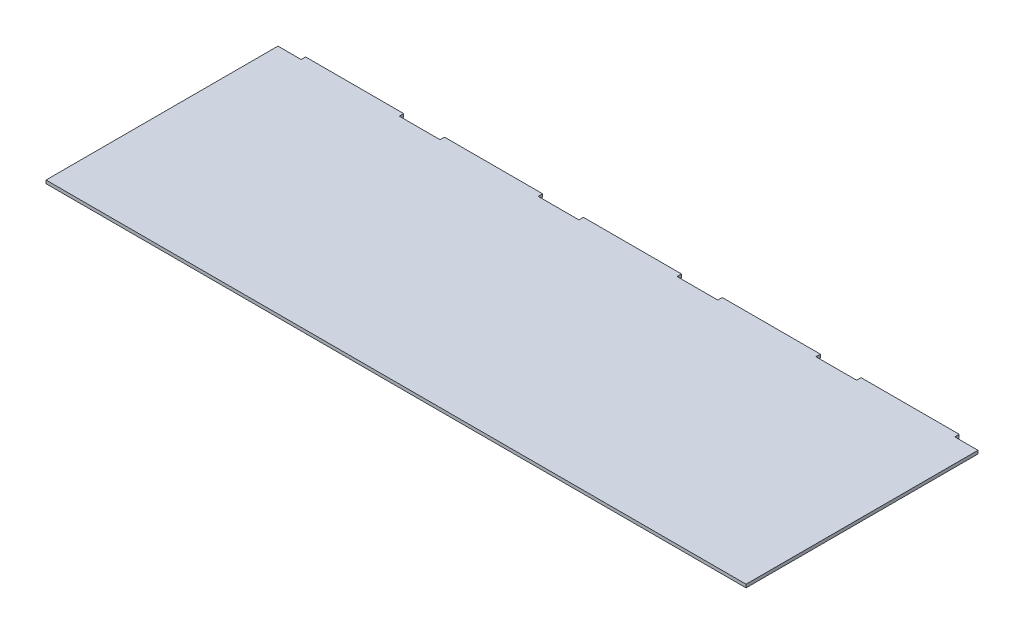
ISO-10303-21;
HEADER;
FILE_DESCRIPTION(('STEP AP214'),'2;1');
FILE_NAME('part.step','',(''),(''),'','','');
FILE_SCHEMA(('AUTOMOTIVE_DESIGN { 1 0 10303 214 1 1 1 1 }'));
ENDSEC;
DATA;
#1=APPLICATION_CONTEXT('core data for automotive mechanical design processes');
#2=APPLICATION_PROTOCOL_DEFINITION('international standard','automotive_design',2000,#1);
#3=PRODUCT_CONTEXT('',#1,'mechanical');
#4=PRODUCT('Part','Part','',(#3));
#5=PRODUCT_RELATED_PRODUCT_CATEGORY('part','',(#4));
#6=PRODUCT_DEFINITION_FORMATION('','',#4);
#7=PRODUCT_DEFINITION_CONTEXT('part definition',#1,'design');
#8=PRODUCT_DEFINITION('design','',#6,#7);
#9=PRODUCT_DEFINITION_SHAPE('','',#8);
#10=(LENGTH_UNIT() NAMED_UNIT(*) SI_UNIT(.MILLI.,.METRE.));
#11=(NAMED_UNIT(*) PLANE_ANGLE_UNIT() SI_UNIT($,.RADIAN.));
#12=(NAMED_UNIT(*) SI_UNIT($,.STERADIAN.) SOLID_ANGLE_UNIT());
#13=UNCERTAINTY_MEASURE_WITH_UNIT(LENGTH_MEASURE(1.E-05),#10,'distance_accuracy_value','');
#14=(GEOMETRIC_REPRESENTATION_CONTEXT(3) GLOBAL_UNCERTAINTY_ASSIGNED_CONTEXT((#13)) GLOBAL_UNIT_ASSIGNED_CONTEXT((#10,
#11,#12)) REPRESENTATION_CONTEXT('',''));
#15=CARTESIAN_POINT('',(0.,0.,0.));
#16=DIRECTION('',(0.,0.,1.));
#17=DIRECTION('',(1.,0.,0.));
#18=AXIS2_PLACEMENT_3D('',#15,#16,#17);
#19=CARTESIAN_POINT('',(-249.174,1.143,-82.55));
#20=DIRECTION('',(0.,0.,1.));
#21=DIRECTION('',(1.,0.,0.));
#22=AXIS2_PLACEMENT_3D('',#19,#20,#21);
#23=PLANE('',#22);
#24=DIRECTION('',(0.,1.,0.));
#25=VECTOR('',#24,1.);
#26=CARTESIAN_POINT('',(-232.6386,1.14300000000078,-82.55));
#27=LINE('',#26,#25);
#28=CARTESIAN_POINT('',(-232.6386,-1.14299999999922,-82.55));
#29=VERTEX_POINT('',#28);
#30=CARTESIAN_POINT('',(-232.6386,1.143,-82.55));
#31=VERTEX_POINT('',#30);
#32=EDGE_CURVE('E440',#29,#31,#27,.T.);
#33=ORIENTED_EDGE('',*,*,#32,.F.);
#34=DIRECTION('',(-1.,0.,0.));
#35=VECTOR('',#34,1.);
#36=CARTESIAN_POINT('',(-249.174,-1.143,-82.55));
#37=LINE('',#36,#35);
#38=CARTESIAN_POINT('',(-249.174,-1.143,-82.55));
#39=VERTEX_POINT('',#38);
#40=EDGE_CURVE('E220',#29,#39,#37,.T.);
#41=ORIENTED_EDGE('',*,*,#40,.T.);
#42=DIRECTION('',(0.,-1.,0.));
#43=VECTOR('',#42,1.);
#44=CARTESIAN_POINT('',(-249.174,1.143,-82.55));
#45=LINE('',#44,#43);
#46=CARTESIAN_POINT('',(-249.174,1.143,-82.55));
#47=VERTEX_POINT('',#46);
#48=EDGE_CURVE('E43',#47,#39,#45,.T.);
#49=ORIENTED_EDGE('',*,*,#48,.F.);
#50=DIRECTION('',(-1.,0.,0.));
#51=VECTOR('',#50,1.);
#52=CARTESIAN_POINT('',(-249.174,1.143,-82.55));
#53=LINE('',#52,#51);
#54=EDGE_CURVE('E50',#31,#47,#53,.T.);
#55=ORIENTED_EDGE('',*,*,#54,.F.);
#56=EDGE_LOOP('',(#33,#41,#49,#55));
#57=FACE_BOUND('',#56,.T.);
#58=ADVANCED_FACE('F35',(#57),#23,.F.);
#59=DIRECTION('',(0.,-1.,0.));
#60=VECTOR('',#59,1.);
#61=CARTESIAN_POINT('',(-162.7886,-1.14299999999945,-82.55));
#62=LINE('',#61,#60);
#63=CARTESIAN_POINT('',(-162.7886,1.143,-82.55));
#64=VERTEX_POINT('',#63);
#65=CARTESIAN_POINT('',(-162.7886,-1.143,-82.55));
#66=VERTEX_POINT('',#65);
#67=EDGE_CURVE('E58',#64,#66,#62,.T.);
#68=ORIENTED_EDGE('',*,*,#67,.F.);
#69=CARTESIAN_POINT('',(-133.7818,1.143,-82.55));
#70=VERTEX_POINT('',#69);
#71=EDGE_CURVE('E376',#70,#64,#53,.T.);
#72=ORIENTED_EDGE('',*,*,#71,.F.);
#73=DIRECTION('',(0.,1.,0.));
#74=VECTOR('',#73,1.);
#75=CARTESIAN_POINT('',(-133.7818,1.14300000000044,-82.55));
#76=LINE('',#75,#74);
#77=CARTESIAN_POINT('',(-133.7818,-1.14299999999956,-82.55));
#78=VERTEX_POINT('',#77);
#79=EDGE_CURVE('E221',#78,#70,#76,.T.);
#80=ORIENTED_EDGE('',*,*,#79,.F.);
#81=EDGE_CURVE('E436',#78,#66,#37,.T.);
#82=ORIENTED_EDGE('',*,*,#81,.T.);
#83=EDGE_LOOP('',(#68,#72,#80,#82));
#84=FACE_BOUND('',#83,.T.);
#85=ADVANCED_FACE('F435',(#84),#23,.F.);
#86=DIRECTION('',(0.,-1.,0.));
#87=VECTOR('',#86,1.);
#88=CARTESIAN_POINT('',(-63.9318000000001,-1.1429999999998,-82.55));
#89=LINE('',#88,#87);
#90=CARTESIAN_POINT('',(-63.9318000000001,1.143,-82.55));
#91=VERTEX_POINT('',#90);
#92=CARTESIAN_POINT('',(-63.9318000000001,-1.143,-82.55));
#93=VERTEX_POINT('',#92);
#94=EDGE_CURVE('E224',#91,#93,#89,.T.);
#95=ORIENTED_EDGE('',*,*,#94,.F.);
#96=CARTESIAN_POINT('',(-34.9250000000001,1.143,-82.55));
#97=VERTEX_POINT('',#96);
#98=EDGE_CURVE('E377',#97,#91,#53,.T.);
#99=ORIENTED_EDGE('',*,*,#98,.F.);
#100=DIRECTION('',(0.,1.,0.));
#101=VECTOR('',#100,1.);
#102=CARTESIAN_POINT('',(-34.925,1.14300000000009,-82.55));
#103=LINE('',#102,#101);
#104=CARTESIAN_POINT('',(-34.925,-1.14299999999991,-82.55));
#105=VERTEX_POINT('',#104);
#106=EDGE_CURVE('E253',#105,#97,#103,.T.);
#107=ORIENTED_EDGE('',*,*,#106,.F.);
#108=EDGE_CURVE('E421',#105,#93,#37,.T.);
#109=ORIENTED_EDGE('',*,*,#108,.T.);
#110=EDGE_LOOP('',(#95,#99,#107,#109));
#111=FACE_BOUND('',#110,.T.);
#112=ADVANCED_FACE('F420',(#111),#23,.F.);
#113=DIRECTION('',(0.,-1.,0.));
#114=VECTOR('',#113,1.);
#115=CARTESIAN_POINT('',(34.925,-1.14300000000014,-82.55));
#116=LINE('',#115,#114);
#117=CARTESIAN_POINT('',(34.9249999999998,1.143,-82.55));
#118=VERTEX_POINT('',#117);
#119=CARTESIAN_POINT('',(34.9249999999998,-1.143,-82.55));
#120=VERTEX_POINT('',#119);
#121=EDGE_CURVE('E258',#118,#120,#116,.T.);
#122=ORIENTED_EDGE('',*,*,#121,.F.);
#123=CARTESIAN_POINT('',(63.9317999999998,1.143,-82.55));
#124=VERTEX_POINT('',#123);
#125=EDGE_CURVE('E381',#124,#118,#53,.T.);
#126=ORIENTED_EDGE('',*,*,#125,.F.);
#127=DIRECTION('',(0.,1.,0.));
#128=VECTOR('',#127,1.);
#129=CARTESIAN_POINT('',(63.9318,1.14299999999975,-82.55));
#130=LINE('',#129,#128);
#131=CARTESIAN_POINT('',(63.9318,-1.14300000000025,-82.55));
#132=VERTEX_POINT('',#131);
#133=EDGE_CURVE('E280',#132,#124,#130,.T.);
#134=ORIENTED_EDGE('',*,*,#133,.F.);
#135=EDGE_CURVE('E405',#132,#120,#37,.T.);
#136=ORIENTED_EDGE('',*,*,#135,.T.);
#137=EDGE_LOOP('',(#122,#126,#134,#136));
#138=FACE_BOUND('',#137,.T.);
#139=ADVANCED_FACE('F404',(#138),#23,.F.);
#140=DIRECTION('',(0.,-1.,0.));
#141=VECTOR('',#140,1.);
#142=CARTESIAN_POINT('',(133.7818,-1.14300000000049,-82.55));
#143=LINE('',#142,#141);
#144=CARTESIAN_POINT('',(133.7818,1.143,-82.55));
#145=VERTEX_POINT('',#144);
#146=CARTESIAN_POINT('',(133.7818,-1.143,-82.55));
#147=VERTEX_POINT('',#146);
#148=EDGE_CURVE('E285',#145,#147,#143,.T.);
#149=ORIENTED_EDGE('',*,*,#148,.F.);
#150=CARTESIAN_POINT('',(162.7886,1.1429999999994,-82.55));
#151=VERTEX_POINT('',#150);
#152=EDGE_CURVE('E343',#151,#145,#53,.T.);
#153=ORIENTED_EDGE('',*,*,#152,.F.);
#154=DIRECTION('',(0.,1.,0.));
#155=VECTOR('',#154,1.);
#156=CARTESIAN_POINT('',(162.7886,1.1429999999994,-82.55));
#157=LINE('',#156,#155);
#158=CARTESIAN_POINT('',(162.7886,-1.143,-82.55));
#159=VERTEX_POINT('',#158);
#160=EDGE_CURVE('E307',#159,#151,#157,.T.);
#161=ORIENTED_EDGE('',*,*,#160,.F.);
#162=EDGE_CURVE('E353',#159,#147,#37,.T.);
#163=ORIENTED_EDGE('',*,*,#162,.T.);
#164=EDGE_LOOP('',(#149,#153,#161,#163));
#165=FACE_BOUND('',#164,.T.);
#166=ADVANCED_FACE('F453',(#165),#23,.F.);
#167=DIRECTION('',(0.,-1.,0.));
#168=VECTOR('',#167,1.);
#169=CARTESIAN_POINT('',(232.6386,-1.14300000000083,-82.55));
#170=LINE('',#169,#168);
#171=CARTESIAN_POINT('',(232.6386,1.143,-82.55));
#172=VERTEX_POINT('',#171);
#173=CARTESIAN_POINT('',(232.6386,-1.143,-82.55));
#174=VERTEX_POINT('',#173);
#175=EDGE_CURVE('E312',#172,#174,#170,.T.);
#176=ORIENTED_EDGE('',*,*,#175,.F.);
#177=CARTESIAN_POINT('',(249.174,1.143,-82.55));
#178=VERTEX_POINT('',#177);
#179=EDGE_CURVE('E339',#178,#172,#53,.T.);
#180=ORIENTED_EDGE('',*,*,#179,.F.);
#181=DIRECTION('',(0.,-1.,0.));
#182=VECTOR('',#181,1.);
#183=CARTESIAN_POINT('',(249.174,1.143,-82.55));
#184=LINE('',#183,#182);
#185=CARTESIAN_POINT('',(249.174,-1.143,-82.55));
#186=VERTEX_POINT('',#185);
#187=EDGE_CURVE('E11',#178,#186,#184,.T.);
#188=ORIENTED_EDGE('',*,*,#187,.T.);
#189=EDGE_CURVE('E350',#186,#174,#37,.T.);
#190=ORIENTED_EDGE('',*,*,#189,.T.);
#191=EDGE_LOOP('',(#176,#180,#188,#190));
#192=FACE_BOUND('',#191,.T.);
#193=ADVANCED_FACE('F447',(#192),#23,.F.);
#194=CARTESIAN_POINT('',(249.174,1.143,-82.55));
#195=DIRECTION('',(-1.,0.,0.));
#196=DIRECTION('',(0.,0.,1.));
#197=AXIS2_PLACEMENT_3D('',#194,#195,#196);
#198=PLANE('',#197);
#199=DIRECTION('',(0.,0.,-1.));
#200=VECTOR('',#199,1.);
#201=CARTESIAN_POINT('',(249.174,-1.143,-82.55));
#202=LINE('',#201,#200);
#203=CARTESIAN_POINT('',(249.174,-1.143,82.55));
#204=VERTEX_POINT('',#203);
#205=EDGE_CURVE('E334',#204,#186,#202,.T.);
#206=ORIENTED_EDGE('',*,*,#205,.T.);
#207=ORIENTED_EDGE('',*,*,#187,.F.);
#208=DIRECTION('',(0.,0.,-1.));
#209=VECTOR('',#208,1.);
#210=CARTESIAN_POINT('',(249.174,1.143,-82.55));
#211=LINE('',#210,#209);
#212=CARTESIAN_POINT('',(249.174,1.143,82.55));
#213=VERTEX_POINT('',#212);
#214=EDGE_CURVE('E335',#213,#178,#211,.T.);
#215=ORIENTED_EDGE('',*,*,#214,.F.);
#216=DIRECTION('',(0.,-1.,0.));
#217=VECTOR('',#216,1.);
#218=CARTESIAN_POINT('',(249.174,1.143,82.55));
#219=LINE('',#218,#217);
#220=EDGE_CURVE('E347',#213,#204,#219,.T.);
#221=ORIENTED_EDGE('',*,*,#220,.T.);
#222=EDGE_LOOP('',(#206,#207,#215,#221));
#223=FACE_BOUND('',#222,.T.);
#224=ADVANCED_FACE('F37',(#223),#198,.F.);
#225=CARTESIAN_POINT('',(-249.174,1.143,-82.55));
#226=DIRECTION('',(1.,0.,0.));
#227=DIRECTION('',(0.,0.,-1.));
#228=AXIS2_PLACEMENT_3D('',#225,#226,#227);
#229=PLANE('',#228);
#230=DIRECTION('',(0.,0.,1.));
#231=VECTOR('',#230,1.);
#232=CARTESIAN_POINT('',(-249.174,-1.143,-82.55));
#233=LINE('',#232,#231);
#234=CARTESIAN_POINT('',(-249.174,-1.143,82.55));
#235=VERTEX_POINT('',#234);
#236=EDGE_CURVE('E352',#39,#235,#233,.T.);
#237=ORIENTED_EDGE('',*,*,#236,.T.);
#238=DIRECTION('',(0.,-1.,0.));
#239=VECTOR('',#238,1.);
#240=CARTESIAN_POINT('',(-249.174,1.143,82.55));
#241=LINE('',#240,#239);
#242=CARTESIAN_POINT('',(-249.174,1.143,82.55));
#243=VERTEX_POINT('',#242);
#244=EDGE_CURVE('E358',#243,#235,#241,.T.);
#245=ORIENTED_EDGE('',*,*,#244,.F.);
#246=DIRECTION('',(0.,0.,1.));
#247=VECTOR('',#246,1.);
#248=CARTESIAN_POINT('',(-249.174,1.143,-82.55));
#249=LINE('',#248,#247);
#250=EDGE_CURVE('E342',#47,#243,#249,.T.);
#251=ORIENTED_EDGE('',*,*,#250,.F.);
#252=ORIENTED_EDGE('',*,*,#48,.T.);
#253=EDGE_LOOP('',(#237,#245,#251,#252));
#254=FACE_BOUND('',#253,.T.);
#255=ADVANCED_FACE('F363',(#254),#229,.F.);
#256=CARTESIAN_POINT('',(-249.174,1.143,82.55));
#257=DIRECTION('',(0.,0.,-1.));
#258=DIRECTION('',(-1.,0.,0.));
#259=AXIS2_PLACEMENT_3D('',#256,#257,#258);
#260=PLANE('',#259);
#261=DIRECTION('',(1.,0.,0.));
#262=VECTOR('',#261,1.);
#263=CARTESIAN_POINT('',(-249.174,-1.143,82.55));
#264=LINE('',#263,#262);
#265=EDGE_CURVE('E338',#235,#204,#264,.T.);
#266=ORIENTED_EDGE('',*,*,#265,.T.);
#267=ORIENTED_EDGE('',*,*,#220,.F.);
#268=DIRECTION('',(1.,0.,0.));
#269=VECTOR('',#268,1.);
#270=CARTESIAN_POINT('',(-249.174,1.143,82.55));
#271=LINE('',#270,#269);
#272=EDGE_CURVE('E345',#243,#213,#271,.T.);
#273=ORIENTED_EDGE('',*,*,#272,.F.);
#274=ORIENTED_EDGE('',*,*,#244,.T.);
#275=EDGE_LOOP('',(#266,#267,#273,#274));
#276=FACE_BOUND('',#275,.T.);
#277=ADVANCED_FACE('F368',(#276),#260,.F.);
#278=CARTESIAN_POINT('',(0.,1.143,0.));
#279=DIRECTION('',(0.,1.,0.));
#280=DIRECTION('',(0.,0.,1.));
#281=AXIS2_PLACEMENT_3D('',#278,#279,#280);
#282=PLANE('',#281);
#283=ORIENTED_EDGE('',*,*,#214,.T.);
#284=ORIENTED_EDGE('',*,*,#179,.T.);
#285=DIRECTION('',(0.,0.,1.));
#286=VECTOR('',#285,1.);
#287=CARTESIAN_POINT('',(232.6386,1.14299999999917,-85.725));
#288=LINE('',#287,#286);
#289=CARTESIAN_POINT('',(232.6386,1.14299999999917,-85.725));
#290=VERTEX_POINT('',#289);
#291=EDGE_CURVE('E325',#290,#172,#288,.T.);
#292=ORIENTED_EDGE('',*,*,#291,.F.);
#293=DIRECTION('',(1.,0.,0.));
#294=VECTOR('',#293,1.);
#295=CARTESIAN_POINT('',(232.6386,1.14299999999917,-85.725));
#296=LINE('',#295,#294);
#297=CARTESIAN_POINT('',(162.7886,1.1429999999994,-85.725));
#298=VERTEX_POINT('',#297);
#299=EDGE_CURVE('E314',#298,#290,#296,.T.);
#300=ORIENTED_EDGE('',*,*,#299,.F.);
#301=DIRECTION('',(0.,0.,1.));
#302=VECTOR('',#301,1.);
#303=CARTESIAN_POINT('',(162.7886,1.1429999999994,-85.725));
#304=LINE('',#303,#302);
#305=EDGE_CURVE('E328',#298,#151,#304,.T.);
#306=ORIENTED_EDGE('',*,*,#305,.T.);
#307=ORIENTED_EDGE('',*,*,#152,.T.);
#308=DIRECTION('',(0.,0.,1.));
#309=VECTOR('',#308,1.);
#310=CARTESIAN_POINT('',(133.7818,1.14299999999951,-85.725));
#311=LINE('',#310,#309);
#312=CARTESIAN_POINT('',(133.7818,1.14299999999951,-85.725));
#313=VERTEX_POINT('',#312);
#314=EDGE_CURVE('E298',#313,#145,#311,.T.);
#315=ORIENTED_EDGE('',*,*,#314,.F.);
#316=DIRECTION('',(1.,0.,0.));
#317=VECTOR('',#316,1.);
#318=CARTESIAN_POINT('',(133.7818,1.14299999999951,-85.725));
#319=LINE('',#318,#317);
#320=CARTESIAN_POINT('',(63.9318,1.14299999999975,-85.725));
#321=VERTEX_POINT('',#320);
#322=EDGE_CURVE('E287',#321,#313,#319,.T.);
#323=ORIENTED_EDGE('',*,*,#322,.F.);
#324=DIRECTION('',(0.,0.,1.));
#325=VECTOR('',#324,1.);
#326=CARTESIAN_POINT('',(63.9318,1.14299999999975,-85.725));
#327=LINE('',#326,#325);
#328=EDGE_CURVE('E301',#321,#124,#327,.T.);
#329=ORIENTED_EDGE('',*,*,#328,.T.);
#330=ORIENTED_EDGE('',*,*,#125,.T.);
#331=DIRECTION('',(0.,0.,1.));
#332=VECTOR('',#331,1.);
#333=CARTESIAN_POINT('',(34.925,1.14299999999986,-85.725));
#334=LINE('',#333,#332);
#335=CARTESIAN_POINT('',(34.925,1.14299999999986,-85.725));
#336=VERTEX_POINT('',#335);
#337=EDGE_CURVE('E271',#336,#118,#334,.T.);
#338=ORIENTED_EDGE('',*,*,#337,.F.);
#339=DIRECTION('',(1.,0.,0.));
#340=VECTOR('',#339,1.);
#341=CARTESIAN_POINT('',(34.925,1.14299999999986,-85.725));
#342=LINE('',#341,#340);
#343=CARTESIAN_POINT('',(-34.925,1.14300000000009,-85.725));
#344=VERTEX_POINT('',#343);
#345=EDGE_CURVE('E260',#344,#336,#342,.T.);
#346=ORIENTED_EDGE('',*,*,#345,.F.);
#347=DIRECTION('',(0.,0.,1.));
#348=VECTOR('',#347,1.);
#349=CARTESIAN_POINT('',(-34.925,1.14300000000009,-85.725));
#350=LINE('',#349,#348);
#351=EDGE_CURVE('E274',#344,#97,#350,.T.);
#352=ORIENTED_EDGE('',*,*,#351,.T.);
#353=ORIENTED_EDGE('',*,*,#98,.T.);
#354=DIRECTION('',(0.,0.,1.));
#355=VECTOR('',#354,1.);
#356=CARTESIAN_POINT('',(-63.9318000000001,1.1430000000002,-85.725));
#357=LINE('',#356,#355);
#358=CARTESIAN_POINT('',(-63.9318000000001,1.1430000000002,-85.725));
#359=VERTEX_POINT('',#358);
#360=EDGE_CURVE('E244',#359,#91,#357,.T.);
#361=ORIENTED_EDGE('',*,*,#360,.F.);
#362=DIRECTION('',(1.,0.,0.));
#363=VECTOR('',#362,1.);
#364=CARTESIAN_POINT('',(-63.9318000000001,1.1430000000002,-85.725));
#365=LINE('',#364,#363);
#366=CARTESIAN_POINT('',(-133.7818,1.14300000000044,-85.725));
#367=VERTEX_POINT('',#366);
#368=EDGE_CURVE('E235',#367,#359,#365,.T.);
#369=ORIENTED_EDGE('',*,*,#368,.F.);
#370=DIRECTION('',(0.,0.,1.));
#371=VECTOR('',#370,1.);
#372=CARTESIAN_POINT('',(-133.7818,1.14300000000044,-85.725));
#373=LINE('',#372,#371);
#374=EDGE_CURVE('E247',#367,#70,#373,.T.);
#375=ORIENTED_EDGE('',*,*,#374,.T.);
#376=ORIENTED_EDGE('',*,*,#71,.T.);
#377=DIRECTION('',(0.,0.,1.));
#378=VECTOR('',#377,1.);
#379=CARTESIAN_POINT('',(-162.7886,1.14300000000055,-85.725));
#380=LINE('',#379,#378);
#381=CARTESIAN_POINT('',(-162.7886,1.14300000000055,-85.725));
#382=VERTEX_POINT('',#381);
#383=EDGE_CURVE('E226',#382,#64,#380,.T.);
#384=ORIENTED_EDGE('',*,*,#383,.F.);
#385=DIRECTION('',(1.,0.,0.));
#386=VECTOR('',#385,1.);
#387=CARTESIAN_POINT('',(-162.7886,1.14300000000055,-85.725));
#388=LINE('',#387,#386);
#389=CARTESIAN_POINT('',(-232.6386,1.14300000000078,-85.725));
#390=VERTEX_POINT('',#389);
#391=EDGE_CURVE('E206',#390,#382,#388,.T.);
#392=ORIENTED_EDGE('',*,*,#391,.F.);
#393=DIRECTION('',(0.,0.,1.));
#394=VECTOR('',#393,1.);
#395=CARTESIAN_POINT('',(-232.6386,1.14300000000078,-85.725));
#396=LINE('',#395,#394);
#397=EDGE_CURVE('E203',#390,#31,#396,.T.);
#398=ORIENTED_EDGE('',*,*,#397,.T.);
#399=ORIENTED_EDGE('',*,*,#54,.T.);
#400=ORIENTED_EDGE('',*,*,#250,.T.);
#401=ORIENTED_EDGE('',*,*,#272,.T.);
#402=EDGE_LOOP('',(#283,#284,#292,#300,#306,#307,#315,#323,#329,#330,#338,#346,#352,#353,#361,
#369,#375,#376,#384,#392,#398,#399,#400,#401));
#403=FACE_BOUND('',#402,.T.);
#404=ADVANCED_FACE('F374',(#403),#282,.T.);
#405=CARTESIAN_POINT('',(0.,-1.143,0.));
#406=DIRECTION('',(0.,1.,0.));
#407=DIRECTION('',(0.,0.,1.));
#408=AXIS2_PLACEMENT_3D('',#405,#406,#407);
#409=PLANE('',#408);
#410=ORIENTED_EDGE('',*,*,#205,.F.);
#411=ORIENTED_EDGE('',*,*,#265,.F.);
#412=ORIENTED_EDGE('',*,*,#236,.F.);
#413=ORIENTED_EDGE('',*,*,#40,.F.);
#414=DIRECTION('',(0.,0.,1.));
#415=VECTOR('',#414,1.);
#416=CARTESIAN_POINT('',(-232.6386,-1.14299999999922,-85.725));
#417=LINE('',#416,#415);
#418=CARTESIAN_POINT('',(-232.6386,-1.14299999999922,-85.725));
#419=VERTEX_POINT('',#418);
#420=EDGE_CURVE('E201',#419,#29,#417,.T.);
#421=ORIENTED_EDGE('',*,*,#420,.F.);
#422=DIRECTION('',(-1.,0.,0.));
#423=VECTOR('',#422,1.);
#424=CARTESIAN_POINT('',(-232.6386,-1.14299999999922,-85.725));
#425=LINE('',#424,#423);
#426=CARTESIAN_POINT('',(-162.7886,-1.14299999999945,-85.725));
#427=VERTEX_POINT('',#426);
#428=EDGE_CURVE('E207',#427,#419,#425,.T.);
#429=ORIENTED_EDGE('',*,*,#428,.F.);
#430=DIRECTION('',(0.,0.,1.));
#431=VECTOR('',#430,1.);
#432=CARTESIAN_POINT('',(-162.7886,-1.14299999999945,-85.725));
#433=LINE('',#432,#431);
#434=EDGE_CURVE('E439',#427,#66,#433,.T.);
#435=ORIENTED_EDGE('',*,*,#434,.T.);
#436=ORIENTED_EDGE('',*,*,#81,.F.);
#437=DIRECTION('',(0.,0.,1.));
#438=VECTOR('',#437,1.);
#439=CARTESIAN_POINT('',(-133.7818,-1.14299999999956,-85.725));
#440=LINE('',#439,#438);
#441=CARTESIAN_POINT('',(-133.7818,-1.14299999999956,-85.725));
#442=VERTEX_POINT('',#441);
#443=EDGE_CURVE('E250',#442,#78,#440,.T.);
#444=ORIENTED_EDGE('',*,*,#443,.F.);
#445=DIRECTION('',(-1.,0.,0.));
#446=VECTOR('',#445,1.);
#447=CARTESIAN_POINT('',(-133.7818,-1.14299999999956,-85.725));
#448=LINE('',#447,#446);
#449=CARTESIAN_POINT('',(-63.9318000000001,-1.1429999999998,-85.725));
#450=VERTEX_POINT('',#449);
#451=EDGE_CURVE('E230',#450,#442,#448,.T.);
#452=ORIENTED_EDGE('',*,*,#451,.F.);
#453=DIRECTION('',(0.,0.,1.));
#454=VECTOR('',#453,1.);
#455=CARTESIAN_POINT('',(-63.9318000000001,-1.1429999999998,-85.725));
#456=LINE('',#455,#454);
#457=EDGE_CURVE('E238',#450,#93,#456,.T.);
#458=ORIENTED_EDGE('',*,*,#457,.T.);
#459=ORIENTED_EDGE('',*,*,#108,.F.);
#460=DIRECTION('',(0.,0.,1.));
#461=VECTOR('',#460,1.);
#462=CARTESIAN_POINT('',(-34.925,-1.14299999999991,-85.725));
#463=LINE('',#462,#461);
#464=CARTESIAN_POINT('',(-34.925,-1.14299999999991,-85.725));
#465=VERTEX_POINT('',#464);
#466=EDGE_CURVE('E277',#465,#105,#463,.T.);
#467=ORIENTED_EDGE('',*,*,#466,.F.);
#468=DIRECTION('',(-1.,0.,0.));
#469=VECTOR('',#468,1.);
#470=CARTESIAN_POINT('',(-34.925,-1.14299999999991,-85.725));
#471=LINE('',#470,#469);
#472=CARTESIAN_POINT('',(34.925,-1.14300000000014,-85.725));
#473=VERTEX_POINT('',#472);
#474=EDGE_CURVE('E254',#473,#465,#471,.T.);
#475=ORIENTED_EDGE('',*,*,#474,.F.);
#476=DIRECTION('',(0.,0.,1.));
#477=VECTOR('',#476,1.);
#478=CARTESIAN_POINT('',(34.925,-1.14300000000014,-85.725));
#479=LINE('',#478,#477);
#480=EDGE_CURVE('E264',#473,#120,#479,.T.);
#481=ORIENTED_EDGE('',*,*,#480,.T.);
#482=ORIENTED_EDGE('',*,*,#135,.F.);
#483=DIRECTION('',(0.,0.,1.));
#484=VECTOR('',#483,1.);
#485=CARTESIAN_POINT('',(63.9318,-1.14300000000025,-85.725));
#486=LINE('',#485,#484);
#487=CARTESIAN_POINT('',(63.9318,-1.14300000000025,-85.725));
#488=VERTEX_POINT('',#487);
#489=EDGE_CURVE('E304',#488,#132,#486,.T.);
#490=ORIENTED_EDGE('',*,*,#489,.F.);
#491=DIRECTION('',(-1.,0.,0.));
#492=VECTOR('',#491,1.);
#493=CARTESIAN_POINT('',(63.9318,-1.14300000000025,-85.725));
#494=LINE('',#493,#492);
#495=CARTESIAN_POINT('',(133.7818,-1.14300000000049,-85.725));
#496=VERTEX_POINT('',#495);
#497=EDGE_CURVE('E281',#496,#488,#494,.T.);
#498=ORIENTED_EDGE('',*,*,#497,.F.);
#499=DIRECTION('',(0.,0.,1.));
#500=VECTOR('',#499,1.);
#501=CARTESIAN_POINT('',(133.7818,-1.14300000000049,-85.725));
#502=LINE('',#501,#500);
#503=EDGE_CURVE('E291',#496,#147,#502,.T.);
#504=ORIENTED_EDGE('',*,*,#503,.T.);
#505=ORIENTED_EDGE('',*,*,#162,.F.);
#506=DIRECTION('',(0.,0.,1.));
#507=VECTOR('',#506,1.);
#508=CARTESIAN_POINT('',(162.7886,-1.1430000000006,-85.725));
#509=LINE('',#508,#507);
#510=CARTESIAN_POINT('',(162.7886,-1.1430000000006,-85.725));
#511=VERTEX_POINT('',#510);
#512=EDGE_CURVE('E331',#511,#159,#509,.T.);
#513=ORIENTED_EDGE('',*,*,#512,.F.);
#514=DIRECTION('',(-1.,0.,0.));
#515=VECTOR('',#514,1.);
#516=CARTESIAN_POINT('',(162.7886,-1.1430000000006,-85.725));
#517=LINE('',#516,#515);
#518=CARTESIAN_POINT('',(232.6386,-1.14300000000083,-85.725));
#519=VERTEX_POINT('',#518);
#520=EDGE_CURVE('E308',#519,#511,#517,.T.);
#521=ORIENTED_EDGE('',*,*,#520,.F.);
#522=DIRECTION('',(0.,0.,1.));
#523=VECTOR('',#522,1.);
#524=CARTESIAN_POINT('',(232.6386,-1.14300000000083,-85.725));
#525=LINE('',#524,#523);
#526=EDGE_CURVE('E318',#519,#174,#525,.T.);
#527=ORIENTED_EDGE('',*,*,#526,.T.);
#528=ORIENTED_EDGE('',*,*,#189,.F.);
#529=EDGE_LOOP('',(#410,#411,#412,#413,#421,#429,#435,#436,#444,#452,#458,#459,#467,#475,#481,
#482,#490,#498,#504,#505,#513,#521,#527,#528));
#530=FACE_BOUND('',#529,.T.);
#531=ADVANCED_FACE('F218',(#530),#409,.F.);
#532=CARTESIAN_POINT('',(162.7886,1.1429999999994,-85.725));
#533=DIRECTION('',(1.,0.,0.));
#534=DIRECTION('',(0.,0.,-1.));
#535=AXIS2_PLACEMENT_3D('',#532,#533,#534);
#536=PLANE('',#535);
#537=ORIENTED_EDGE('',*,*,#160,.T.);
#538=ORIENTED_EDGE('',*,*,#305,.F.);
#539=DIRECTION('',(0.,1.,0.));
#540=VECTOR('',#539,1.);
#541=CARTESIAN_POINT('',(162.7886,1.1429999999994,-85.725));
#542=LINE('',#541,#540);
#543=EDGE_CURVE('E311',#511,#298,#542,.T.);
#544=ORIENTED_EDGE('',*,*,#543,.F.);
#545=ORIENTED_EDGE('',*,*,#512,.T.);
#546=EDGE_LOOP('',(#537,#538,#544,#545));
#547=FACE_BOUND('',#546,.T.);
#548=ADVANCED_FACE('F469',(#547),#536,.F.);
#549=CARTESIAN_POINT('',(232.6386,-1.14300000000083,-85.725));
#550=DIRECTION('',(-1.,0.,0.));
#551=DIRECTION('',(0.,0.,1.));
#552=AXIS2_PLACEMENT_3D('',#549,#550,#551);
#553=PLANE('',#552);
#554=ORIENTED_EDGE('',*,*,#175,.T.);
#555=ORIENTED_EDGE('',*,*,#526,.F.);
#556=DIRECTION('',(0.,-1.,0.));
#557=VECTOR('',#556,1.);
#558=CARTESIAN_POINT('',(232.6386,-1.14300000000083,-85.725));
#559=LINE('',#558,#557);
#560=EDGE_CURVE('E316',#290,#519,#559,.T.);
#561=ORIENTED_EDGE('',*,*,#560,.F.);
#562=ORIENTED_EDGE('',*,*,#291,.T.);
#563=EDGE_LOOP('',(#554,#555,#561,#562));
#564=FACE_BOUND('',#563,.T.);
#565=ADVANCED_FACE('F461',(#564),#553,.F.);
#566=CARTESIAN_POINT('',(0.,0.,-85.725));
#567=DIRECTION('',(0.,0.,1.));
#568=DIRECTION('',(1.,0.,0.));
#569=AXIS2_PLACEMENT_3D('',#566,#567,#568);
#570=PLANE('',#569);
#571=ORIENTED_EDGE('',*,*,#520,.T.);
#572=ORIENTED_EDGE('',*,*,#543,.T.);
#573=ORIENTED_EDGE('',*,*,#299,.T.);
#574=ORIENTED_EDGE('',*,*,#560,.T.);
#575=EDGE_LOOP('',(#571,#572,#573,#574));
#576=FACE_BOUND('',#575,.T.);
#577=ADVANCED_FACE('F467',(#576),#570,.F.);
#578=CARTESIAN_POINT('',(63.9318,1.14299999999975,-85.725));
#579=DIRECTION('',(1.,0.,0.));
#580=DIRECTION('',(0.,0.,-1.));
#581=AXIS2_PLACEMENT_3D('',#578,#579,#580);
#582=PLANE('',#581);
#583=ORIENTED_EDGE('',*,*,#133,.T.);
#584=ORIENTED_EDGE('',*,*,#328,.F.);
#585=DIRECTION('',(0.,1.,0.));
#586=VECTOR('',#585,1.);
#587=CARTESIAN_POINT('',(63.9318,1.14299999999975,-85.725));
#588=LINE('',#587,#586);
#589=EDGE_CURVE('E284',#488,#321,#588,.T.);
#590=ORIENTED_EDGE('',*,*,#589,.F.);
#591=ORIENTED_EDGE('',*,*,#489,.T.);
#592=EDGE_LOOP('',(#583,#584,#590,#591));
#593=FACE_BOUND('',#592,.T.);
#594=ADVANCED_FACE('F401',(#593),#582,.F.);
#595=CARTESIAN_POINT('',(133.7818,-1.14300000000049,-85.725));
#596=DIRECTION('',(-1.,0.,0.));
#597=DIRECTION('',(0.,0.,1.));
#598=AXIS2_PLACEMENT_3D('',#595,#596,#597);
#599=PLANE('',#598);
#600=ORIENTED_EDGE('',*,*,#148,.T.);
#601=ORIENTED_EDGE('',*,*,#503,.F.);
#602=DIRECTION('',(0.,-1.,0.));
#603=VECTOR('',#602,1.);
#604=CARTESIAN_POINT('',(133.7818,-1.14300000000049,-85.725));
#605=LINE('',#604,#603);
#606=EDGE_CURVE('E289',#313,#496,#605,.T.);
#607=ORIENTED_EDGE('',*,*,#606,.F.);
#608=ORIENTED_EDGE('',*,*,#314,.T.);
#609=EDGE_LOOP('',(#600,#601,#607,#608));
#610=FACE_BOUND('',#609,.T.);
#611=ADVANCED_FACE('F393',(#610),#599,.F.);
#612=CARTESIAN_POINT('',(-98.8568,3.45156672417748E-13,-85.725));
#613=DIRECTION('',(0.,0.,1.));
#614=DIRECTION('',(1.,0.,0.));
#615=AXIS2_PLACEMENT_3D('',#612,#613,#614);
#616=PLANE('',#615);
#617=ORIENTED_EDGE('',*,*,#497,.T.);
#618=ORIENTED_EDGE('',*,*,#589,.T.);
#619=ORIENTED_EDGE('',*,*,#322,.T.);
#620=ORIENTED_EDGE('',*,*,#606,.T.);
#621=EDGE_LOOP('',(#617,#618,#619,#620));
#622=FACE_BOUND('',#621,.T.);
#623=ADVANCED_FACE('F397',(#622),#616,.F.);
#624=CARTESIAN_POINT('',(-34.925,1.14300000000009,-85.725));
#625=DIRECTION('',(1.,0.,0.));
#626=DIRECTION('',(0.,0.,-1.));
#627=AXIS2_PLACEMENT_3D('',#624,#625,#626);
#628=PLANE('',#627);
#629=ORIENTED_EDGE('',*,*,#106,.T.);
#630=ORIENTED_EDGE('',*,*,#351,.F.);
#631=DIRECTION('',(0.,1.,0.));
#632=VECTOR('',#631,1.);
#633=CARTESIAN_POINT('',(-34.925,1.14300000000009,-85.725));
#634=LINE('',#633,#632);
#635=EDGE_CURVE('E257',#465,#344,#634,.T.);
#636=ORIENTED_EDGE('',*,*,#635,.F.);
#637=ORIENTED_EDGE('',*,*,#466,.T.);
#638=EDGE_LOOP('',(#629,#630,#636,#637));
#639=FACE_BOUND('',#638,.T.);
#640=ADVANCED_FACE('F417',(#639),#628,.F.);
#641=CARTESIAN_POINT('',(34.925,-1.14300000000014,-85.725));
#642=DIRECTION('',(-1.,0.,0.));
#643=DIRECTION('',(0.,0.,1.));
#644=AXIS2_PLACEMENT_3D('',#641,#642,#643);
#645=PLANE('',#644);
#646=ORIENTED_EDGE('',*,*,#121,.T.);
#647=ORIENTED_EDGE('',*,*,#480,.F.);
#648=DIRECTION('',(0.,-1.,0.));
#649=VECTOR('',#648,1.);
#650=CARTESIAN_POINT('',(34.925,-1.14300000000014,-85.725));
#651=LINE('',#650,#649);
#652=EDGE_CURVE('E262',#336,#473,#651,.T.);
#653=ORIENTED_EDGE('',*,*,#652,.F.);
#654=ORIENTED_EDGE('',*,*,#337,.T.);
#655=EDGE_LOOP('',(#646,#647,#653,#654));
#656=FACE_BOUND('',#655,.T.);
#657=ADVANCED_FACE('F408',(#656),#645,.F.);
#658=CARTESIAN_POINT('',(-197.7136,6.90313344835496E-13,-85.725));
#659=DIRECTION('',(0.,0.,1.));
#660=DIRECTION('',(1.,0.,0.));
#661=AXIS2_PLACEMENT_3D('',#658,#659,#660);
#662=PLANE('',#661);
#663=ORIENTED_EDGE('',*,*,#474,.T.);
#664=ORIENTED_EDGE('',*,*,#635,.T.);
#665=ORIENTED_EDGE('',*,*,#345,.T.);
#666=ORIENTED_EDGE('',*,*,#652,.T.);
#667=EDGE_LOOP('',(#663,#664,#665,#666));
#668=FACE_BOUND('',#667,.T.);
#669=ADVANCED_FACE('F413',(#668),#662,.F.);
#670=CARTESIAN_POINT('',(-133.7818,1.14300000000044,-85.725));
#671=DIRECTION('',(1.,0.,0.));
#672=DIRECTION('',(0.,0.,-1.));
#673=AXIS2_PLACEMENT_3D('',#670,#671,#672);
#674=PLANE('',#673);
#675=ORIENTED_EDGE('',*,*,#79,.T.);
#676=ORIENTED_EDGE('',*,*,#374,.F.);
#677=DIRECTION('',(0.,1.,0.));
#678=VECTOR('',#677,1.);
#679=CARTESIAN_POINT('',(-133.7818,1.14300000000044,-85.725));
#680=LINE('',#679,#678);
#681=EDGE_CURVE('E233',#442,#367,#680,.T.);
#682=ORIENTED_EDGE('',*,*,#681,.F.);
#683=ORIENTED_EDGE('',*,*,#443,.T.);
#684=EDGE_LOOP('',(#675,#676,#682,#683));
#685=FACE_BOUND('',#684,.T.);
#686=ADVANCED_FACE('F433',(#685),#674,.F.);
#687=CARTESIAN_POINT('',(-63.9318000000001,-1.1429999999998,-85.725));
#688=DIRECTION('',(-1.,0.,0.));
#689=DIRECTION('',(0.,0.,1.));
#690=AXIS2_PLACEMENT_3D('',#687,#688,#689);
#691=PLANE('',#690);
#692=ORIENTED_EDGE('',*,*,#94,.T.);
#693=ORIENTED_EDGE('',*,*,#457,.F.);
#694=DIRECTION('',(0.,-1.,0.));
#695=VECTOR('',#694,1.);
#696=CARTESIAN_POINT('',(-63.9318000000001,-1.1429999999998,-85.725));
#697=LINE('',#696,#695);
#698=EDGE_CURVE('E237',#359,#450,#697,.T.);
#699=ORIENTED_EDGE('',*,*,#698,.F.);
#700=ORIENTED_EDGE('',*,*,#360,.T.);
#701=EDGE_LOOP('',(#692,#693,#699,#700));
#702=FACE_BOUND('',#701,.T.);
#703=ADVANCED_FACE('F424',(#702),#691,.F.);
#704=CARTESIAN_POINT('',(-296.5704,1.03547001725324E-12,-85.725));
#705=DIRECTION('',(0.,0.,1.));
#706=DIRECTION('',(1.,0.,0.));
#707=AXIS2_PLACEMENT_3D('',#704,#705,#706);
#708=PLANE('',#707);
#709=ORIENTED_EDGE('',*,*,#451,.T.);
#710=ORIENTED_EDGE('',*,*,#681,.T.);
#711=ORIENTED_EDGE('',*,*,#368,.T.);
#712=ORIENTED_EDGE('',*,*,#698,.T.);
#713=EDGE_LOOP('',(#709,#710,#711,#712));
#714=FACE_BOUND('',#713,.T.);
#715=ADVANCED_FACE('F429',(#714),#708,.F.);
#716=CARTESIAN_POINT('',(-232.6386,1.14300000000078,-85.725));
#717=DIRECTION('',(1.,0.,0.));
#718=DIRECTION('',(0.,0.,-1.));
#719=AXIS2_PLACEMENT_3D('',#716,#717,#718);
#720=PLANE('',#719);
#721=ORIENTED_EDGE('',*,*,#32,.T.);
#722=ORIENTED_EDGE('',*,*,#397,.F.);
#723=DIRECTION('',(0.,1.,0.));
#724=VECTOR('',#723,1.);
#725=CARTESIAN_POINT('',(-232.6386,1.14300000000078,-85.725));
#726=LINE('',#725,#724);
#727=EDGE_CURVE('E197',#419,#390,#726,.T.);
#728=ORIENTED_EDGE('',*,*,#727,.F.);
#729=ORIENTED_EDGE('',*,*,#420,.T.);
#730=EDGE_LOOP('',(#721,#722,#728,#729));
#731=FACE_BOUND('',#730,.T.);
#732=ADVANCED_FACE('F199',(#731),#720,.F.);
#733=CARTESIAN_POINT('',(-162.7886,-1.14299999999945,-85.725));
#734=DIRECTION('',(-1.,0.,0.));
#735=DIRECTION('',(0.,0.,1.));
#736=AXIS2_PLACEMENT_3D('',#733,#734,#735);
#737=PLANE('',#736);
#738=ORIENTED_EDGE('',*,*,#67,.T.);
#739=ORIENTED_EDGE('',*,*,#434,.F.);
#740=DIRECTION('',(0.,-1.,0.));
#741=VECTOR('',#740,1.);
#742=CARTESIAN_POINT('',(-162.7886,-1.14299999999945,-85.725));
#743=LINE('',#742,#741);
#744=EDGE_CURVE('E212',#382,#427,#743,.T.);
#745=ORIENTED_EDGE('',*,*,#744,.F.);
#746=ORIENTED_EDGE('',*,*,#383,.T.);
#747=EDGE_LOOP('',(#738,#739,#745,#746));
#748=FACE_BOUND('',#747,.T.);
#749=ADVANCED_FACE('F438',(#748),#737,.F.);
#750=CARTESIAN_POINT('',(-395.4272,1.38062668967099E-12,-85.725));
#751=DIRECTION('',(0.,0.,1.));
#752=DIRECTION('',(1.,0.,0.));
#753=AXIS2_PLACEMENT_3D('',#750,#751,#752);
#754=PLANE('',#753);
#755=ORIENTED_EDGE('',*,*,#428,.T.);
#756=ORIENTED_EDGE('',*,*,#727,.T.);
#757=ORIENTED_EDGE('',*,*,#391,.T.);
#758=ORIENTED_EDGE('',*,*,#744,.T.);
#759=EDGE_LOOP('',(#755,#756,#757,#758));
#760=FACE_BOUND('',#759,.T.);
#761=ADVANCED_FACE('F210',(#760),#754,.F.);
#762=CLOSED_SHELL('',(#58,#85,#112,#139,#166,#193,#224,#255,#277,#404,#531,#548,#565,#577,#594,
#611,#623,#640,#657,#669,#686,#703,#715,#732,#749,#761));
#763=MANIFOLD_SOLID_BREP('B2',#762);
#764=ADVANCED_BREP_SHAPE_REPRESENTATION('',(#18,#763),#14);
#765=SHAPE_DEFINITION_REPRESENTATION(#9,#764);
ENDSEC;
END-ISO-10303-21;
